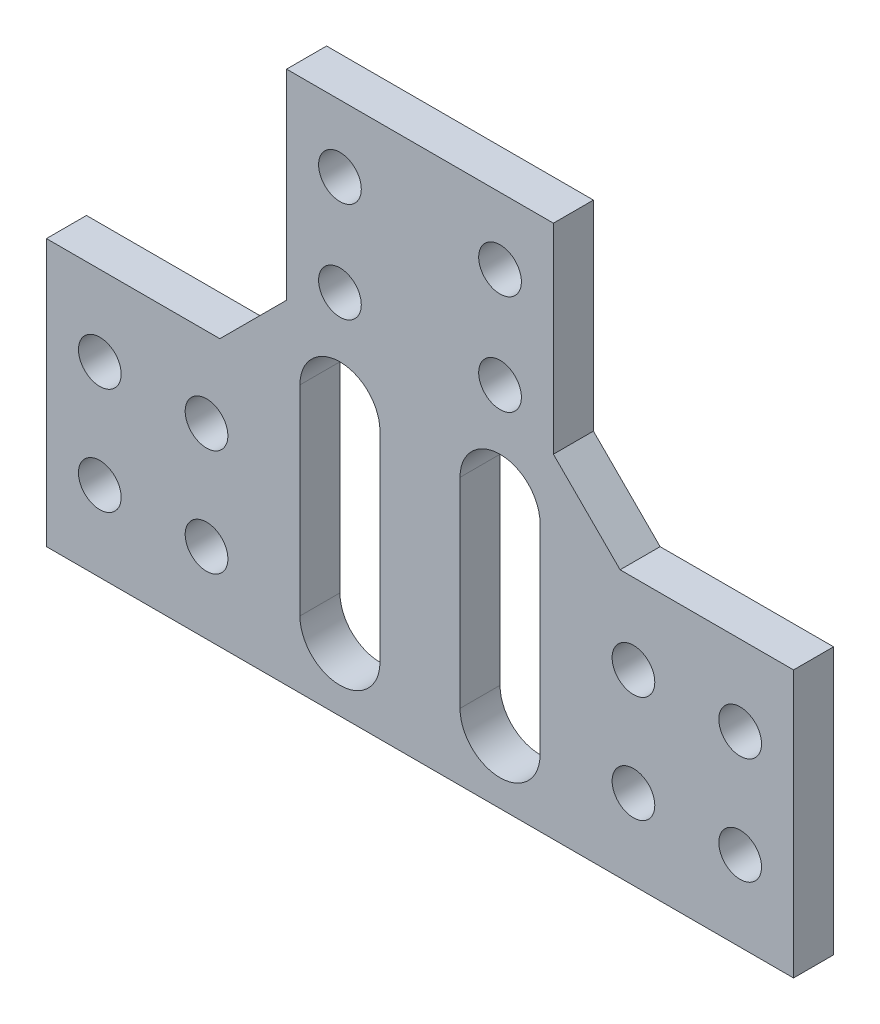
ISO-10303-21;
HEADER;
FILE_DESCRIPTION(('STEP AP214'),'2;1');
FILE_NAME('part.step','',(''),(''),'','','');
FILE_SCHEMA(('AUTOMOTIVE_DESIGN { 1 0 10303 214 1 1 1 1 }'));
ENDSEC;
DATA;
#1=APPLICATION_CONTEXT('core data for automotive mechanical design processes');
#2=APPLICATION_PROTOCOL_DEFINITION('international standard','automotive_design',2000,#1);
#3=PRODUCT_CONTEXT('',#1,'mechanical');
#4=PRODUCT('Part','Part','',(#3));
#5=PRODUCT_RELATED_PRODUCT_CATEGORY('part','',(#4));
#6=PRODUCT_DEFINITION_FORMATION('','',#4);
#7=PRODUCT_DEFINITION_CONTEXT('part definition',#1,'design');
#8=PRODUCT_DEFINITION('design','',#6,#7);
#9=PRODUCT_DEFINITION_SHAPE('','',#8);
#10=(LENGTH_UNIT() NAMED_UNIT(*) SI_UNIT(.MILLI.,.METRE.));
#11=(NAMED_UNIT(*) PLANE_ANGLE_UNIT() SI_UNIT($,.RADIAN.));
#12=(NAMED_UNIT(*) SI_UNIT($,.STERADIAN.) SOLID_ANGLE_UNIT());
#13=UNCERTAINTY_MEASURE_WITH_UNIT(LENGTH_MEASURE(1.E-05),#10,'distance_accuracy_value','');
#14=(GEOMETRIC_REPRESENTATION_CONTEXT(3) GLOBAL_UNCERTAINTY_ASSIGNED_CONTEXT((#13)) GLOBAL_UNIT_ASSIGNED_CONTEXT((#10,
#11,#12)) REPRESENTATION_CONTEXT('',''));
#15=CARTESIAN_POINT('',(0.,0.,0.));
#16=DIRECTION('',(0.,0.,1.));
#17=DIRECTION('',(1.,0.,0.));
#18=AXIS2_PLACEMENT_3D('',#15,#16,#17);
#19=CARTESIAN_POINT('',(0.,20.,3.));
#20=DIRECTION('',(1.,0.,0.));
#21=DIRECTION('',(0.,1.,0.));
#22=AXIS2_PLACEMENT_3D('',#19,#20,#21);
#23=PLANE('',#22);
#24=DIRECTION('',(0.,-1.,0.));
#25=VECTOR('',#24,1.);
#26=CARTESIAN_POINT('',(0.,20.,0.));
#27=LINE('',#26,#25);
#28=CARTESIAN_POINT('',(0.,20.,0.));
#29=VERTEX_POINT('',#28);
#30=CARTESIAN_POINT('',(0.,0.,0.));
#31=VERTEX_POINT('',#30);
#32=EDGE_CURVE('E280',#29,#31,#27,.T.);
#33=ORIENTED_EDGE('',*,*,#32,.T.);
#34=DIRECTION('',(0.,0.,-1.));
#35=VECTOR('',#34,1.);
#36=CARTESIAN_POINT('',(0.,0.,3.));
#37=LINE('',#36,#35);
#38=CARTESIAN_POINT('',(0.,0.,3.));
#39=VERTEX_POINT('',#38);
#40=EDGE_CURVE('E351',#39,#31,#37,.T.);
#41=ORIENTED_EDGE('',*,*,#40,.F.);
#42=DIRECTION('',(0.,-1.,0.));
#43=VECTOR('',#42,1.);
#44=CARTESIAN_POINT('',(0.,20.,3.));
#45=LINE('',#44,#43);
#46=CARTESIAN_POINT('',(0.,20.,3.));
#47=VERTEX_POINT('',#46);
#48=EDGE_CURVE('E283',#47,#39,#45,.T.);
#49=ORIENTED_EDGE('',*,*,#48,.F.);
#50=DIRECTION('',(0.,0.,-1.));
#51=VECTOR('',#50,1.);
#52=CARTESIAN_POINT('',(0.,20.,3.));
#53=LINE('',#52,#51);
#54=EDGE_CURVE('E305',#47,#29,#53,.T.);
#55=ORIENTED_EDGE('',*,*,#54,.T.);
#56=EDGE_LOOP('',(#33,#41,#49,#55));
#57=FACE_BOUND('',#56,.T.);
#58=ADVANCED_FACE('F35',(#57),#23,.F.);
#59=CARTESIAN_POINT('',(0.,0.,3.));
#60=DIRECTION('',(0.,1.,0.));
#61=DIRECTION('',(-1.,0.,0.));
#62=AXIS2_PLACEMENT_3D('',#59,#60,#61);
#63=PLANE('',#62);
#64=DIRECTION('',(1.,0.,0.));
#65=VECTOR('',#64,1.);
#66=CARTESIAN_POINT('',(0.,0.,0.));
#67=LINE('',#66,#65);
#68=CARTESIAN_POINT('',(56.,0.,0.));
#69=VERTEX_POINT('',#68);
#70=EDGE_CURVE('E308',#31,#69,#67,.T.);
#71=ORIENTED_EDGE('',*,*,#70,.T.);
#72=DIRECTION('',(0.,0.,-1.));
#73=VECTOR('',#72,1.);
#74=CARTESIAN_POINT('',(56.,0.,3.));
#75=LINE('',#74,#73);
#76=CARTESIAN_POINT('',(56.,0.,3.));
#77=VERTEX_POINT('',#76);
#78=EDGE_CURVE('E348',#77,#69,#75,.T.);
#79=ORIENTED_EDGE('',*,*,#78,.F.);
#80=DIRECTION('',(1.,0.,0.));
#81=VECTOR('',#80,1.);
#82=CARTESIAN_POINT('',(0.,0.,3.));
#83=LINE('',#82,#81);
#84=EDGE_CURVE('E286',#39,#77,#83,.T.);
#85=ORIENTED_EDGE('',*,*,#84,.F.);
#86=ORIENTED_EDGE('',*,*,#40,.T.);
#87=EDGE_LOOP('',(#71,#79,#85,#86));
#88=FACE_BOUND('',#87,.T.);
#89=ADVANCED_FACE('F390',(#88),#63,.F.);
#90=CARTESIAN_POINT('',(56.,0.,3.));
#91=DIRECTION('',(-1.,0.,0.));
#92=DIRECTION('',(0.,0.,1.));
#93=AXIS2_PLACEMENT_3D('',#90,#91,#92);
#94=PLANE('',#93);
#95=DIRECTION('',(0.,1.,0.));
#96=VECTOR('',#95,1.);
#97=CARTESIAN_POINT('',(56.,0.,0.));
#98=LINE('',#97,#96);
#99=CARTESIAN_POINT('',(56.,20.,0.));
#100=VERTEX_POINT('',#99);
#101=EDGE_CURVE('E310',#69,#100,#98,.T.);
#102=ORIENTED_EDGE('',*,*,#101,.T.);
#103=DIRECTION('',(0.,0.,-1.));
#104=VECTOR('',#103,1.);
#105=CARTESIAN_POINT('',(56.,20.,3.));
#106=LINE('',#105,#104);
#107=CARTESIAN_POINT('',(56.,20.,3.));
#108=VERTEX_POINT('',#107);
#109=EDGE_CURVE('E345',#108,#100,#106,.T.);
#110=ORIENTED_EDGE('',*,*,#109,.F.);
#111=DIRECTION('',(0.,1.,0.));
#112=VECTOR('',#111,1.);
#113=CARTESIAN_POINT('',(56.,0.,3.));
#114=LINE('',#113,#112);
#115=EDGE_CURVE('E289',#77,#108,#114,.T.);
#116=ORIENTED_EDGE('',*,*,#115,.F.);
#117=ORIENTED_EDGE('',*,*,#78,.T.);
#118=EDGE_LOOP('',(#102,#110,#116,#117));
#119=FACE_BOUND('',#118,.T.);
#120=ADVANCED_FACE('F395',(#119),#94,.F.);
#121=CARTESIAN_POINT('',(56.,20.,3.));
#122=DIRECTION('',(0.,-1.,0.));
#123=DIRECTION('',(1.,0.,0.));
#124=AXIS2_PLACEMENT_3D('',#121,#122,#123);
#125=PLANE('',#124);
#126=DIRECTION('',(-1.,0.,0.));
#127=VECTOR('',#126,1.);
#128=CARTESIAN_POINT('',(56.,20.,0.));
#129=LINE('',#128,#127);
#130=CARTESIAN_POINT('',(43.,20.,0.));
#131=VERTEX_POINT('',#130);
#132=EDGE_CURVE('E312',#100,#131,#129,.T.);
#133=ORIENTED_EDGE('',*,*,#132,.T.);
#134=DIRECTION('',(0.,0.,-1.));
#135=VECTOR('',#134,1.);
#136=CARTESIAN_POINT('',(43.,20.,3.));
#137=LINE('',#136,#135);
#138=CARTESIAN_POINT('',(43.,20.,3.));
#139=VERTEX_POINT('',#138);
#140=EDGE_CURVE('E342',#139,#131,#137,.T.);
#141=ORIENTED_EDGE('',*,*,#140,.F.);
#142=DIRECTION('',(-1.,0.,0.));
#143=VECTOR('',#142,1.);
#144=CARTESIAN_POINT('',(56.,20.,3.));
#145=LINE('',#144,#143);
#146=EDGE_CURVE('E291',#108,#139,#145,.T.);
#147=ORIENTED_EDGE('',*,*,#146,.F.);
#148=ORIENTED_EDGE('',*,*,#109,.T.);
#149=EDGE_LOOP('',(#133,#141,#147,#148));
#150=FACE_BOUND('',#149,.T.);
#151=ADVANCED_FACE('F439',(#150),#125,.F.);
#152=CARTESIAN_POINT('',(43.,20.,3.));
#153=DIRECTION('',(-0.707106781186549,-0.707106781186546,0.));
#154=DIRECTION('',(0.707106781186546,-0.707106781186549,0.));
#155=AXIS2_PLACEMENT_3D('',#152,#153,#154);
#156=PLANE('',#155);
#157=DIRECTION('',(-0.707106781186546,0.707106781186549,0.));
#158=VECTOR('',#157,1.);
#159=CARTESIAN_POINT('',(43.,20.,0.));
#160=LINE('',#159,#158);
#161=CARTESIAN_POINT('',(38.,25.,0.));
#162=VERTEX_POINT('',#161);
#163=EDGE_CURVE('E314',#131,#162,#160,.T.);
#164=ORIENTED_EDGE('',*,*,#163,.T.);
#165=DIRECTION('',(0.,0.,-1.));
#166=VECTOR('',#165,1.);
#167=CARTESIAN_POINT('',(38.,25.,3.));
#168=LINE('',#167,#166);
#169=CARTESIAN_POINT('',(38.,25.,3.));
#170=VERTEX_POINT('',#169);
#171=EDGE_CURVE('E339',#170,#162,#168,.T.);
#172=ORIENTED_EDGE('',*,*,#171,.F.);
#173=DIRECTION('',(-0.707106781186546,0.707106781186549,0.));
#174=VECTOR('',#173,1.);
#175=CARTESIAN_POINT('',(43.,20.,3.));
#176=LINE('',#175,#174);
#177=EDGE_CURVE('E293',#139,#170,#176,.T.);
#178=ORIENTED_EDGE('',*,*,#177,.F.);
#179=ORIENTED_EDGE('',*,*,#140,.T.);
#180=EDGE_LOOP('',(#164,#172,#178,#179));
#181=FACE_BOUND('',#180,.T.);
#182=ADVANCED_FACE('F434',(#181),#156,.F.);
#183=CARTESIAN_POINT('',(38.,25.,3.));
#184=DIRECTION('',(-1.,0.,0.));
#185=DIRECTION('',(0.,0.,1.));
#186=AXIS2_PLACEMENT_3D('',#183,#184,#185);
#187=PLANE('',#186);
#188=DIRECTION('',(0.,1.,0.));
#189=VECTOR('',#188,1.);
#190=CARTESIAN_POINT('',(38.,25.,0.));
#191=LINE('',#190,#189);
#192=CARTESIAN_POINT('',(38.,40.,0.));
#193=VERTEX_POINT('',#192);
#194=EDGE_CURVE('E316',#162,#193,#191,.T.);
#195=ORIENTED_EDGE('',*,*,#194,.T.);
#196=DIRECTION('',(0.,0.,-1.));
#197=VECTOR('',#196,1.);
#198=CARTESIAN_POINT('',(38.,40.,3.));
#199=LINE('',#198,#197);
#200=CARTESIAN_POINT('',(38.,40.,3.));
#201=VERTEX_POINT('',#200);
#202=EDGE_CURVE('E336',#201,#193,#199,.T.);
#203=ORIENTED_EDGE('',*,*,#202,.F.);
#204=DIRECTION('',(0.,1.,0.));
#205=VECTOR('',#204,1.);
#206=CARTESIAN_POINT('',(38.,25.,3.));
#207=LINE('',#206,#205);
#208=EDGE_CURVE('E295',#170,#201,#207,.T.);
#209=ORIENTED_EDGE('',*,*,#208,.F.);
#210=ORIENTED_EDGE('',*,*,#171,.T.);
#211=EDGE_LOOP('',(#195,#203,#209,#210));
#212=FACE_BOUND('',#211,.T.);
#213=ADVANCED_FACE('F430',(#212),#187,.F.);
#214=CARTESIAN_POINT('',(38.,40.,3.));
#215=DIRECTION('',(0.,-1.,0.));
#216=DIRECTION('',(0.,0.,-1.));
#217=AXIS2_PLACEMENT_3D('',#214,#215,#216);
#218=PLANE('',#217);
#219=DIRECTION('',(-1.,0.,0.));
#220=VECTOR('',#219,1.);
#221=CARTESIAN_POINT('',(38.,40.,0.));
#222=LINE('',#221,#220);
#223=CARTESIAN_POINT('',(18.,40.,0.));
#224=VERTEX_POINT('',#223);
#225=EDGE_CURVE('E318',#193,#224,#222,.T.);
#226=ORIENTED_EDGE('',*,*,#225,.T.);
#227=DIRECTION('',(0.,0.,-1.));
#228=VECTOR('',#227,1.);
#229=CARTESIAN_POINT('',(18.,40.,3.));
#230=LINE('',#229,#228);
#231=CARTESIAN_POINT('',(18.,40.,3.));
#232=VERTEX_POINT('',#231);
#233=EDGE_CURVE('E333',#232,#224,#230,.T.);
#234=ORIENTED_EDGE('',*,*,#233,.F.);
#235=DIRECTION('',(-1.,0.,0.));
#236=VECTOR('',#235,1.);
#237=CARTESIAN_POINT('',(38.,40.,3.));
#238=LINE('',#237,#236);
#239=EDGE_CURVE('E297',#201,#232,#238,.T.);
#240=ORIENTED_EDGE('',*,*,#239,.F.);
#241=ORIENTED_EDGE('',*,*,#202,.T.);
#242=EDGE_LOOP('',(#226,#234,#240,#241));
#243=FACE_BOUND('',#242,.T.);
#244=ADVANCED_FACE('F426',(#243),#218,.F.);
#245=CARTESIAN_POINT('',(18.,40.,3.));
#246=DIRECTION('',(1.,0.,0.));
#247=DIRECTION('',(0.,1.,0.));
#248=AXIS2_PLACEMENT_3D('',#245,#246,#247);
#249=PLANE('',#248);
#250=DIRECTION('',(0.,-1.,0.));
#251=VECTOR('',#250,1.);
#252=CARTESIAN_POINT('',(18.,40.,0.));
#253=LINE('',#252,#251);
#254=CARTESIAN_POINT('',(18.,25.,0.));
#255=VERTEX_POINT('',#254);
#256=EDGE_CURVE('E320',#224,#255,#253,.T.);
#257=ORIENTED_EDGE('',*,*,#256,.T.);
#258=DIRECTION('',(0.,0.,-1.));
#259=VECTOR('',#258,1.);
#260=CARTESIAN_POINT('',(18.,25.,3.));
#261=LINE('',#260,#259);
#262=CARTESIAN_POINT('',(18.,25.,3.));
#263=VERTEX_POINT('',#262);
#264=EDGE_CURVE('E330',#263,#255,#261,.T.);
#265=ORIENTED_EDGE('',*,*,#264,.F.);
#266=DIRECTION('',(0.,-1.,0.));
#267=VECTOR('',#266,1.);
#268=CARTESIAN_POINT('',(18.,40.,3.));
#269=LINE('',#268,#267);
#270=EDGE_CURVE('E299',#232,#263,#269,.T.);
#271=ORIENTED_EDGE('',*,*,#270,.F.);
#272=ORIENTED_EDGE('',*,*,#233,.T.);
#273=EDGE_LOOP('',(#257,#265,#271,#272));
#274=FACE_BOUND('',#273,.T.);
#275=ADVANCED_FACE('F421',(#274),#249,.F.);
#276=CARTESIAN_POINT('',(18.,25.,3.));
#277=DIRECTION('',(0.707106781186549,-0.707106781186546,0.));
#278=DIRECTION('',(0.707106781186546,0.707106781186549,0.));
#279=AXIS2_PLACEMENT_3D('',#276,#277,#278);
#280=PLANE('',#279);
#281=DIRECTION('',(-0.707106781186546,-0.707106781186549,0.));
#282=VECTOR('',#281,1.);
#283=CARTESIAN_POINT('',(18.,25.,0.));
#284=LINE('',#283,#282);
#285=CARTESIAN_POINT('',(13.,20.,0.));
#286=VERTEX_POINT('',#285);
#287=EDGE_CURVE('E322',#255,#286,#284,.T.);
#288=ORIENTED_EDGE('',*,*,#287,.T.);
#289=DIRECTION('',(0.,0.,-1.));
#290=VECTOR('',#289,1.);
#291=CARTESIAN_POINT('',(13.,20.,3.));
#292=LINE('',#291,#290);
#293=CARTESIAN_POINT('',(13.,20.,3.));
#294=VERTEX_POINT('',#293);
#295=EDGE_CURVE('E327',#294,#286,#292,.T.);
#296=ORIENTED_EDGE('',*,*,#295,.F.);
#297=DIRECTION('',(-0.707106781186546,-0.707106781186549,0.));
#298=VECTOR('',#297,1.);
#299=CARTESIAN_POINT('',(18.,25.,3.));
#300=LINE('',#299,#298);
#301=EDGE_CURVE('E301',#263,#294,#300,.T.);
#302=ORIENTED_EDGE('',*,*,#301,.F.);
#303=ORIENTED_EDGE('',*,*,#264,.T.);
#304=EDGE_LOOP('',(#288,#296,#302,#303));
#305=FACE_BOUND('',#304,.T.);
#306=ADVANCED_FACE('F415',(#305),#280,.F.);
#307=CARTESIAN_POINT('',(13.,20.,3.));
#308=DIRECTION('',(0.,-1.,0.));
#309=DIRECTION('',(0.,0.,-1.));
#310=AXIS2_PLACEMENT_3D('',#307,#308,#309);
#311=PLANE('',#310);
#312=DIRECTION('',(-1.,0.,0.));
#313=VECTOR('',#312,1.);
#314=CARTESIAN_POINT('',(13.,20.,0.));
#315=LINE('',#314,#313);
#316=EDGE_CURVE('E287',#286,#29,#315,.T.);
#317=ORIENTED_EDGE('',*,*,#316,.T.);
#318=ORIENTED_EDGE('',*,*,#54,.F.);
#319=DIRECTION('',(-1.,0.,0.));
#320=VECTOR('',#319,1.);
#321=CARTESIAN_POINT('',(13.,20.,3.));
#322=LINE('',#321,#320);
#323=EDGE_CURVE('E303',#294,#47,#322,.T.);
#324=ORIENTED_EDGE('',*,*,#323,.F.);
#325=ORIENTED_EDGE('',*,*,#295,.T.);
#326=EDGE_LOOP('',(#317,#318,#324,#325));
#327=FACE_BOUND('',#326,.T.);
#328=ADVANCED_FACE('F413',(#327),#311,.F.);
#329=CARTESIAN_POINT('',(0.,0.,3.));
#330=DIRECTION('',(0.,0.,1.));
#331=DIRECTION('',(1.,0.,0.));
#332=AXIS2_PLACEMENT_3D('',#329,#330,#331);
#333=PLANE('',#332);
#334=CARTESIAN_POINT('',(22.,20.,3.));
#335=DIRECTION('',(0.,0.,1.));
#336=DIRECTION('',(1.,0.,0.));
#337=AXIS2_PLACEMENT_3D('',#334,#335,#336);
#338=CIRCLE('',#337,3.);
#339=CARTESIAN_POINT('',(25.,20.,3.));
#340=VERTEX_POINT('',#339);
#341=CARTESIAN_POINT('',(19.,20.,3.));
#342=VERTEX_POINT('',#341);
#343=EDGE_CURVE('E49',#340,#342,#338,.T.);
#344=ORIENTED_EDGE('',*,*,#343,.F.);
#345=DIRECTION('',(0.,1.,0.));
#346=VECTOR('',#345,1.);
#347=CARTESIAN_POINT('',(25.,20.,3.));
#348=LINE('',#347,#346);
#349=CARTESIAN_POINT('',(25.,5.,3.));
#350=VERTEX_POINT('',#349);
#351=EDGE_CURVE('E183',#350,#340,#348,.T.);
#352=ORIENTED_EDGE('',*,*,#351,.F.);
#353=CARTESIAN_POINT('',(22.,5.,3.));
#354=DIRECTION('',(0.,0.,1.));
#355=DIRECTION('',(1.,0.,0.));
#356=AXIS2_PLACEMENT_3D('',#353,#354,#355);
#357=CIRCLE('',#356,3.);
#358=CARTESIAN_POINT('',(19.,5.,3.));
#359=VERTEX_POINT('',#358);
#360=EDGE_CURVE('E166',#359,#350,#357,.T.);
#361=ORIENTED_EDGE('',*,*,#360,.F.);
#362=DIRECTION('',(0.,-1.,0.));
#363=VECTOR('',#362,1.);
#364=CARTESIAN_POINT('',(19.,20.,3.));
#365=LINE('',#364,#363);
#366=EDGE_CURVE('E176',#342,#359,#365,.T.);
#367=ORIENTED_EDGE('',*,*,#366,.F.);
#368=EDGE_LOOP('',(#344,#352,#361,#367));
#369=FACE_BOUND('',#368,.T.);
#370=CARTESIAN_POINT('',(34.,20.,3.));
#371=DIRECTION('',(0.,0.,1.));
#372=DIRECTION('',(1.,0.,0.));
#373=AXIS2_PLACEMENT_3D('',#370,#371,#372);
#374=CIRCLE('',#373,3.);
#375=CARTESIAN_POINT('',(37.,20.,3.));
#376=VERTEX_POINT('',#375);
#377=CARTESIAN_POINT('',(31.,20.,3.));
#378=VERTEX_POINT('',#377);
#379=EDGE_CURVE('E57',#376,#378,#374,.T.);
#380=ORIENTED_EDGE('',*,*,#379,.F.);
#381=DIRECTION('',(0.,1.,0.));
#382=VECTOR('',#381,1.);
#383=CARTESIAN_POINT('',(37.,20.,3.));
#384=LINE('',#383,#382);
#385=CARTESIAN_POINT('',(37.,5.,3.));
#386=VERTEX_POINT('',#385);
#387=EDGE_CURVE('E200',#386,#376,#384,.T.);
#388=ORIENTED_EDGE('',*,*,#387,.F.);
#389=CARTESIAN_POINT('',(34.,5.,3.));
#390=DIRECTION('',(0.,0.,1.));
#391=DIRECTION('',(1.,0.,0.));
#392=AXIS2_PLACEMENT_3D('',#389,#390,#391);
#393=CIRCLE('',#392,3.);
#394=CARTESIAN_POINT('',(31.,5.,3.));
#395=VERTEX_POINT('',#394);
#396=EDGE_CURVE('E197',#395,#386,#393,.T.);
#397=ORIENTED_EDGE('',*,*,#396,.F.);
#398=DIRECTION('',(0.,-1.,0.));
#399=VECTOR('',#398,1.);
#400=CARTESIAN_POINT('',(31.,20.,3.));
#401=LINE('',#400,#399);
#402=EDGE_CURVE('E194',#378,#395,#401,.T.);
#403=ORIENTED_EDGE('',*,*,#402,.F.);
#404=EDGE_LOOP('',(#380,#388,#397,#403));
#405=FACE_BOUND('',#404,.T.);
#406=CARTESIAN_POINT('',(4.,6.,3.));
#407=DIRECTION('',(0.,0.,1.));
#408=DIRECTION('',(1.,0.,0.));
#409=AXIS2_PLACEMENT_3D('',#406,#407,#408);
#410=CIRCLE('',#409,1.6);
#411=CARTESIAN_POINT('',(5.6,6.,3.));
#412=VERTEX_POINT('',#411);
#413=EDGE_CURVE('E245',#412,#412,#410,.T.);
#414=ORIENTED_EDGE('',*,*,#413,.F.);
#415=EDGE_LOOP('',(#414));
#416=FACE_BOUND('',#415,.T.);
#417=CARTESIAN_POINT('',(12.,14.,3.));
#418=DIRECTION('',(0.,0.,1.));
#419=DIRECTION('',(1.,0.,0.));
#420=AXIS2_PLACEMENT_3D('',#417,#418,#419);
#421=CIRCLE('',#420,1.6);
#422=CARTESIAN_POINT('',(13.6,14.,3.));
#423=VERTEX_POINT('',#422);
#424=EDGE_CURVE('E232',#423,#423,#421,.T.);
#425=ORIENTED_EDGE('',*,*,#424,.F.);
#426=EDGE_LOOP('',(#425));
#427=FACE_BOUND('',#426,.T.);
#428=CARTESIAN_POINT('',(12.,6.,3.));
#429=DIRECTION('',(0.,0.,1.));
#430=DIRECTION('',(1.,0.,0.));
#431=AXIS2_PLACEMENT_3D('',#428,#429,#430);
#432=CIRCLE('',#431,1.6);
#433=CARTESIAN_POINT('',(13.6,6.,3.));
#434=VERTEX_POINT('',#433);
#435=EDGE_CURVE('E233',#434,#434,#432,.T.);
#436=ORIENTED_EDGE('',*,*,#435,.F.);
#437=EDGE_LOOP('',(#436));
#438=FACE_BOUND('',#437,.T.);
#439=CARTESIAN_POINT('',(52.,14.,3.));
#440=DIRECTION('',(0.,0.,1.));
#441=DIRECTION('',(1.,0.,0.));
#442=AXIS2_PLACEMENT_3D('',#439,#440,#441);
#443=CIRCLE('',#442,1.6);
#444=CARTESIAN_POINT('',(53.6,14.,3.));
#445=VERTEX_POINT('',#444);
#446=EDGE_CURVE('E214',#445,#445,#443,.T.);
#447=ORIENTED_EDGE('',*,*,#446,.F.);
#448=EDGE_LOOP('',(#447));
#449=FACE_BOUND('',#448,.T.);
#450=CARTESIAN_POINT('',(34.,35.,3.));
#451=DIRECTION('',(0.,0.,1.));
#452=DIRECTION('',(1.,0.,0.));
#453=AXIS2_PLACEMENT_3D('',#450,#451,#452);
#454=CIRCLE('',#453,1.6);
#455=CARTESIAN_POINT('',(35.6,35.,3.));
#456=VERTEX_POINT('',#455);
#457=EDGE_CURVE('E269',#456,#456,#454,.T.);
#458=ORIENTED_EDGE('',*,*,#457,.F.);
#459=EDGE_LOOP('',(#458));
#460=FACE_BOUND('',#459,.T.);
#461=CARTESIAN_POINT('',(22.,27.5,3.));
#462=DIRECTION('',(0.,0.,1.));
#463=DIRECTION('',(1.,0.,0.));
#464=AXIS2_PLACEMENT_3D('',#461,#462,#463);
#465=CIRCLE('',#464,1.6);
#466=CARTESIAN_POINT('',(23.6,27.5,3.));
#467=VERTEX_POINT('',#466);
#468=EDGE_CURVE('E256',#467,#467,#465,.T.);
#469=ORIENTED_EDGE('',*,*,#468,.F.);
#470=EDGE_LOOP('',(#469));
#471=FACE_BOUND('',#470,.T.);
#472=CARTESIAN_POINT('',(34.,27.5,3.));
#473=DIRECTION('',(0.,0.,1.));
#474=DIRECTION('',(1.,0.,0.));
#475=AXIS2_PLACEMENT_3D('',#472,#473,#474);
#476=CIRCLE('',#475,1.6);
#477=CARTESIAN_POINT('',(35.6,27.5,3.));
#478=VERTEX_POINT('',#477);
#479=EDGE_CURVE('E257',#478,#478,#476,.T.);
#480=ORIENTED_EDGE('',*,*,#479,.F.);
#481=EDGE_LOOP('',(#480));
#482=FACE_BOUND('',#481,.T.);
#483=CARTESIAN_POINT('',(4.,14.,3.));
#484=DIRECTION('',(0.,0.,1.));
#485=DIRECTION('',(1.,0.,0.));
#486=AXIS2_PLACEMENT_3D('',#483,#484,#485);
#487=CIRCLE('',#486,1.6);
#488=CARTESIAN_POINT('',(5.6,14.,3.));
#489=VERTEX_POINT('',#488);
#490=EDGE_CURVE('E244',#489,#489,#487,.T.);
#491=ORIENTED_EDGE('',*,*,#490,.F.);
#492=EDGE_LOOP('',(#491));
#493=FACE_BOUND('',#492,.T.);
#494=CARTESIAN_POINT('',(52.,6.,3.));
#495=DIRECTION('',(0.,0.,1.));
#496=DIRECTION('',(1.,0.,0.));
#497=AXIS2_PLACEMENT_3D('',#494,#495,#496);
#498=CIRCLE('',#497,1.6);
#499=CARTESIAN_POINT('',(53.6,6.,3.));
#500=VERTEX_POINT('',#499);
#501=EDGE_CURVE('E215',#500,#500,#498,.T.);
#502=ORIENTED_EDGE('',*,*,#501,.F.);
#503=EDGE_LOOP('',(#502));
#504=FACE_BOUND('',#503,.T.);
#505=CARTESIAN_POINT('',(44.,6.,3.));
#506=DIRECTION('',(0.,0.,1.));
#507=DIRECTION('',(1.,0.,0.));
#508=AXIS2_PLACEMENT_3D('',#505,#506,#507);
#509=CIRCLE('',#508,1.6);
#510=CARTESIAN_POINT('',(45.6,6.,3.));
#511=VERTEX_POINT('',#510);
#512=EDGE_CURVE('E221',#511,#511,#509,.T.);
#513=ORIENTED_EDGE('',*,*,#512,.F.);
#514=EDGE_LOOP('',(#513));
#515=FACE_BOUND('',#514,.T.);
#516=CARTESIAN_POINT('',(44.,14.,3.));
#517=DIRECTION('',(0.,0.,1.));
#518=DIRECTION('',(1.,0.,0.));
#519=AXIS2_PLACEMENT_3D('',#516,#517,#518);
#520=CIRCLE('',#519,1.6);
#521=CARTESIAN_POINT('',(45.6,14.,3.));
#522=VERTEX_POINT('',#521);
#523=EDGE_CURVE('E190',#522,#522,#520,.T.);
#524=ORIENTED_EDGE('',*,*,#523,.F.);
#525=EDGE_LOOP('',(#524));
#526=FACE_BOUND('',#525,.T.);
#527=CARTESIAN_POINT('',(22.,35.,3.));
#528=DIRECTION('',(0.,0.,1.));
#529=DIRECTION('',(1.,0.,0.));
#530=AXIS2_PLACEMENT_3D('',#527,#528,#529);
#531=CIRCLE('',#530,1.6);
#532=CARTESIAN_POINT('',(23.6,35.,3.));
#533=VERTEX_POINT('',#532);
#534=EDGE_CURVE('E268',#533,#533,#531,.T.);
#535=ORIENTED_EDGE('',*,*,#534,.F.);
#536=EDGE_LOOP('',(#535));
#537=FACE_BOUND('',#536,.T.);
#538=ORIENTED_EDGE('',*,*,#48,.T.);
#539=ORIENTED_EDGE('',*,*,#84,.T.);
#540=ORIENTED_EDGE('',*,*,#115,.T.);
#541=ORIENTED_EDGE('',*,*,#146,.T.);
#542=ORIENTED_EDGE('',*,*,#177,.T.);
#543=ORIENTED_EDGE('',*,*,#208,.T.);
#544=ORIENTED_EDGE('',*,*,#239,.T.);
#545=ORIENTED_EDGE('',*,*,#270,.T.);
#546=ORIENTED_EDGE('',*,*,#301,.T.);
#547=ORIENTED_EDGE('',*,*,#323,.T.);
#548=EDGE_LOOP('',(#538,#539,#540,#541,#542,#543,#544,#545,#546,#547));
#549=FACE_BOUND('',#548,.T.);
#550=ADVANCED_FACE('F180',(#369,#405,#416,#427,#438,#449,#460,#471,#482,#493,#504,#515,#526,
#537,#549),#333,.T.);
#551=CARTESIAN_POINT('',(0.,0.,0.));
#552=DIRECTION('',(0.,0.,1.));
#553=DIRECTION('',(1.,0.,0.));
#554=AXIS2_PLACEMENT_3D('',#551,#552,#553);
#555=PLANE('',#554);
#556=DIRECTION('',(0.,1.,0.));
#557=VECTOR('',#556,1.);
#558=CARTESIAN_POINT('',(25.,0.,0.));
#559=LINE('',#558,#557);
#560=CARTESIAN_POINT('',(25.,5.,0.));
#561=VERTEX_POINT('',#560);
#562=CARTESIAN_POINT('',(25.,20.,0.));
#563=VERTEX_POINT('',#562);
#564=EDGE_CURVE('E42',#561,#563,#559,.T.);
#565=ORIENTED_EDGE('',*,*,#564,.T.);
#566=CARTESIAN_POINT('',(22.,20.,0.));
#567=DIRECTION('',(0.,0.,1.));
#568=DIRECTION('',(1.,0.,0.));
#569=AXIS2_PLACEMENT_3D('',#566,#567,#568);
#570=CIRCLE('',#569,3.);
#571=CARTESIAN_POINT('',(19.,20.,0.));
#572=VERTEX_POINT('',#571);
#573=EDGE_CURVE('E11',#563,#572,#570,.T.);
#574=ORIENTED_EDGE('',*,*,#573,.T.);
#575=DIRECTION('',(0.,-1.,0.));
#576=VECTOR('',#575,1.);
#577=CARTESIAN_POINT('',(19.,0.,0.));
#578=LINE('',#577,#576);
#579=CARTESIAN_POINT('',(19.,5.,0.));
#580=VERTEX_POINT('',#579);
#581=EDGE_CURVE('E366',#572,#580,#578,.T.);
#582=ORIENTED_EDGE('',*,*,#581,.T.);
#583=CARTESIAN_POINT('',(22.,5.,0.));
#584=DIRECTION('',(0.,0.,1.));
#585=DIRECTION('',(1.,0.,0.));
#586=AXIS2_PLACEMENT_3D('',#583,#584,#585);
#587=CIRCLE('',#586,3.);
#588=EDGE_CURVE('E169',#580,#561,#587,.T.);
#589=ORIENTED_EDGE('',*,*,#588,.T.);
#590=EDGE_LOOP('',(#565,#574,#582,#589));
#591=FACE_BOUND('',#590,.T.);
#592=DIRECTION('',(0.,1.,0.));
#593=VECTOR('',#592,1.);
#594=CARTESIAN_POINT('',(37.,0.,0.));
#595=LINE('',#594,#593);
#596=CARTESIAN_POINT('',(37.,5.,0.));
#597=VERTEX_POINT('',#596);
#598=CARTESIAN_POINT('',(37.,20.,0.));
#599=VERTEX_POINT('',#598);
#600=EDGE_CURVE('E360',#597,#599,#595,.T.);
#601=ORIENTED_EDGE('',*,*,#600,.T.);
#602=CARTESIAN_POINT('',(34.,20.,0.));
#603=DIRECTION('',(0.,0.,1.));
#604=DIRECTION('',(1.,0.,0.));
#605=AXIS2_PLACEMENT_3D('',#602,#603,#604);
#606=CIRCLE('',#605,3.);
#607=CARTESIAN_POINT('',(31.,20.,0.));
#608=VERTEX_POINT('',#607);
#609=EDGE_CURVE('E363',#599,#608,#606,.T.);
#610=ORIENTED_EDGE('',*,*,#609,.T.);
#611=DIRECTION('',(0.,-1.,0.));
#612=VECTOR('',#611,1.);
#613=CARTESIAN_POINT('',(31.,0.,0.));
#614=LINE('',#613,#612);
#615=CARTESIAN_POINT('',(31.,5.,0.));
#616=VERTEX_POINT('',#615);
#617=EDGE_CURVE('E354',#608,#616,#614,.T.);
#618=ORIENTED_EDGE('',*,*,#617,.T.);
#619=CARTESIAN_POINT('',(34.,5.,0.));
#620=DIRECTION('',(0.,0.,1.));
#621=DIRECTION('',(1.,0.,0.));
#622=AXIS2_PLACEMENT_3D('',#619,#620,#621);
#623=CIRCLE('',#622,3.);
#624=EDGE_CURVE('E357',#616,#597,#623,.T.);
#625=ORIENTED_EDGE('',*,*,#624,.T.);
#626=EDGE_LOOP('',(#601,#610,#618,#625));
#627=FACE_BOUND('',#626,.T.);
#628=CARTESIAN_POINT('',(4.,6.,0.));
#629=DIRECTION('',(0.,0.,1.));
#630=DIRECTION('',(1.,0.,0.));
#631=AXIS2_PLACEMENT_3D('',#628,#629,#630);
#632=CIRCLE('',#631,1.6);
#633=CARTESIAN_POINT('',(5.6,6.,0.));
#634=VERTEX_POINT('',#633);
#635=EDGE_CURVE('E241',#634,#634,#632,.T.);
#636=ORIENTED_EDGE('',*,*,#635,.T.);
#637=EDGE_LOOP('',(#636));
#638=FACE_BOUND('',#637,.T.);
#639=CARTESIAN_POINT('',(12.,14.,0.));
#640=DIRECTION('',(0.,0.,1.));
#641=DIRECTION('',(1.,0.,0.));
#642=AXIS2_PLACEMENT_3D('',#639,#640,#641);
#643=CIRCLE('',#642,1.6);
#644=CARTESIAN_POINT('',(13.6,14.,0.));
#645=VERTEX_POINT('',#644);
#646=EDGE_CURVE('E248',#645,#645,#643,.T.);
#647=ORIENTED_EDGE('',*,*,#646,.T.);
#648=EDGE_LOOP('',(#647));
#649=FACE_BOUND('',#648,.T.);
#650=CARTESIAN_POINT('',(12.,6.,0.));
#651=DIRECTION('',(0.,0.,1.));
#652=DIRECTION('',(1.,0.,0.));
#653=AXIS2_PLACEMENT_3D('',#650,#651,#652);
#654=CIRCLE('',#653,1.6);
#655=CARTESIAN_POINT('',(13.6,6.,0.));
#656=VERTEX_POINT('',#655);
#657=EDGE_CURVE('E229',#656,#656,#654,.T.);
#658=ORIENTED_EDGE('',*,*,#657,.T.);
#659=EDGE_LOOP('',(#658));
#660=FACE_BOUND('',#659,.T.);
#661=CARTESIAN_POINT('',(52.,14.,0.));
#662=DIRECTION('',(0.,0.,1.));
#663=DIRECTION('',(1.,0.,0.));
#664=AXIS2_PLACEMENT_3D('',#661,#662,#663);
#665=CIRCLE('',#664,1.6);
#666=CARTESIAN_POINT('',(53.6,14.,0.));
#667=VERTEX_POINT('',#666);
#668=EDGE_CURVE('E236',#667,#667,#665,.T.);
#669=ORIENTED_EDGE('',*,*,#668,.T.);
#670=EDGE_LOOP('',(#669));
#671=FACE_BOUND('',#670,.T.);
#672=CARTESIAN_POINT('',(34.,35.,0.));
#673=DIRECTION('',(0.,0.,1.));
#674=DIRECTION('',(1.,0.,0.));
#675=AXIS2_PLACEMENT_3D('',#672,#673,#674);
#676=CIRCLE('',#675,1.6);
#677=CARTESIAN_POINT('',(35.6,35.,0.));
#678=VERTEX_POINT('',#677);
#679=EDGE_CURVE('E265',#678,#678,#676,.T.);
#680=ORIENTED_EDGE('',*,*,#679,.T.);
#681=EDGE_LOOP('',(#680));
#682=FACE_BOUND('',#681,.T.);
#683=CARTESIAN_POINT('',(22.,27.5,0.));
#684=DIRECTION('',(0.,0.,1.));
#685=DIRECTION('',(1.,0.,0.));
#686=AXIS2_PLACEMENT_3D('',#683,#684,#685);
#687=CIRCLE('',#686,1.6);
#688=CARTESIAN_POINT('',(23.6,27.5,0.));
#689=VERTEX_POINT('',#688);
#690=EDGE_CURVE('E272',#689,#689,#687,.T.);
#691=ORIENTED_EDGE('',*,*,#690,.T.);
#692=EDGE_LOOP('',(#691));
#693=FACE_BOUND('',#692,.T.);
#694=CARTESIAN_POINT('',(34.,27.5,0.));
#695=DIRECTION('',(0.,0.,1.));
#696=DIRECTION('',(1.,0.,0.));
#697=AXIS2_PLACEMENT_3D('',#694,#695,#696);
#698=CIRCLE('',#697,1.6);
#699=CARTESIAN_POINT('',(35.6,27.5,0.));
#700=VERTEX_POINT('',#699);
#701=EDGE_CURVE('E253',#700,#700,#698,.T.);
#702=ORIENTED_EDGE('',*,*,#701,.T.);
#703=EDGE_LOOP('',(#702));
#704=FACE_BOUND('',#703,.T.);
#705=CARTESIAN_POINT('',(4.,14.,0.));
#706=DIRECTION('',(0.,0.,1.));
#707=DIRECTION('',(1.,0.,0.));
#708=AXIS2_PLACEMENT_3D('',#705,#706,#707);
#709=CIRCLE('',#708,1.6);
#710=CARTESIAN_POINT('',(5.6,14.,0.));
#711=VERTEX_POINT('',#710);
#712=EDGE_CURVE('E260',#711,#711,#709,.T.);
#713=ORIENTED_EDGE('',*,*,#712,.T.);
#714=EDGE_LOOP('',(#713));
#715=FACE_BOUND('',#714,.T.);
#716=CARTESIAN_POINT('',(52.,6.,0.));
#717=DIRECTION('',(0.,0.,1.));
#718=DIRECTION('',(1.,0.,0.));
#719=AXIS2_PLACEMENT_3D('',#716,#717,#718);
#720=CIRCLE('',#719,1.6);
#721=CARTESIAN_POINT('',(53.6,6.,0.));
#722=VERTEX_POINT('',#721);
#723=EDGE_CURVE('E211',#722,#722,#720,.T.);
#724=ORIENTED_EDGE('',*,*,#723,.T.);
#725=EDGE_LOOP('',(#724));
#726=FACE_BOUND('',#725,.T.);
#727=CARTESIAN_POINT('',(44.,6.,0.));
#728=DIRECTION('',(0.,0.,1.));
#729=DIRECTION('',(1.,0.,0.));
#730=AXIS2_PLACEMENT_3D('',#727,#728,#729);
#731=CIRCLE('',#730,1.6);
#732=CARTESIAN_POINT('',(45.6,6.,0.));
#733=VERTEX_POINT('',#732);
#734=EDGE_CURVE('E218',#733,#733,#731,.T.);
#735=ORIENTED_EDGE('',*,*,#734,.T.);
#736=EDGE_LOOP('',(#735));
#737=FACE_BOUND('',#736,.T.);
#738=CARTESIAN_POINT('',(44.,14.,0.));
#739=DIRECTION('',(0.,0.,1.));
#740=DIRECTION('',(1.,0.,0.));
#741=AXIS2_PLACEMENT_3D('',#738,#739,#740);
#742=CIRCLE('',#741,1.6);
#743=CARTESIAN_POINT('',(45.6,14.,0.));
#744=VERTEX_POINT('',#743);
#745=EDGE_CURVE('E224',#744,#744,#742,.T.);
#746=ORIENTED_EDGE('',*,*,#745,.T.);
#747=EDGE_LOOP('',(#746));
#748=FACE_BOUND('',#747,.T.);
#749=CARTESIAN_POINT('',(22.,35.,0.));
#750=DIRECTION('',(0.,0.,1.));
#751=DIRECTION('',(1.,0.,0.));
#752=AXIS2_PLACEMENT_3D('',#749,#750,#751);
#753=CIRCLE('',#752,1.6);
#754=CARTESIAN_POINT('',(23.6,35.,0.));
#755=VERTEX_POINT('',#754);
#756=EDGE_CURVE('E277',#755,#755,#753,.T.);
#757=ORIENTED_EDGE('',*,*,#756,.T.);
#758=EDGE_LOOP('',(#757));
#759=FACE_BOUND('',#758,.T.);
#760=ORIENTED_EDGE('',*,*,#32,.F.);
#761=ORIENTED_EDGE('',*,*,#316,.F.);
#762=ORIENTED_EDGE('',*,*,#287,.F.);
#763=ORIENTED_EDGE('',*,*,#256,.F.);
#764=ORIENTED_EDGE('',*,*,#225,.F.);
#765=ORIENTED_EDGE('',*,*,#194,.F.);
#766=ORIENTED_EDGE('',*,*,#163,.F.);
#767=ORIENTED_EDGE('',*,*,#132,.F.);
#768=ORIENTED_EDGE('',*,*,#101,.F.);
#769=ORIENTED_EDGE('',*,*,#70,.F.);
#770=EDGE_LOOP('',(#760,#761,#762,#763,#764,#765,#766,#767,#768,#769));
#771=FACE_BOUND('',#770,.T.);
#772=ADVANCED_FACE('F370',(#591,#627,#638,#649,#660,#671,#682,#693,#704,#715,#726,#737,#748,
#759,#771),#555,.F.);
#773=CARTESIAN_POINT('',(22.,35.,0.));
#774=DIRECTION('',(0.,0.,1.));
#775=DIRECTION('',(1.,0.,0.));
#776=AXIS2_PLACEMENT_3D('',#773,#774,#775);
#777=CYLINDRICAL_SURFACE('',#776,1.6);
#778=ORIENTED_EDGE('',*,*,#756,.F.);
#779=EDGE_LOOP('',(#778));
#780=FACE_BOUND('',#779,.T.);
#781=ORIENTED_EDGE('',*,*,#534,.T.);
#782=EDGE_LOOP('',(#781));
#783=FACE_BOUND('',#782,.T.);
#784=ADVANCED_FACE('F463',(#780,#783),#777,.F.);
#785=CARTESIAN_POINT('',(44.,14.,0.));
#786=DIRECTION('',(0.,0.,1.));
#787=DIRECTION('',(1.,0.,0.));
#788=AXIS2_PLACEMENT_3D('',#785,#786,#787);
#789=CYLINDRICAL_SURFACE('',#788,1.6);
#790=ORIENTED_EDGE('',*,*,#745,.F.);
#791=EDGE_LOOP('',(#790));
#792=FACE_BOUND('',#791,.T.);
#793=ORIENTED_EDGE('',*,*,#523,.T.);
#794=EDGE_LOOP('',(#793));
#795=FACE_BOUND('',#794,.T.);
#796=ADVANCED_FACE('F468',(#792,#795),#789,.F.);
#797=CARTESIAN_POINT('',(44.,6.,0.));
#798=DIRECTION('',(0.,0.,1.));
#799=DIRECTION('',(1.,0.,0.));
#800=AXIS2_PLACEMENT_3D('',#797,#798,#799);
#801=CYLINDRICAL_SURFACE('',#800,1.6);
#802=ORIENTED_EDGE('',*,*,#734,.F.);
#803=EDGE_LOOP('',(#802));
#804=FACE_BOUND('',#803,.T.);
#805=ORIENTED_EDGE('',*,*,#512,.T.);
#806=EDGE_LOOP('',(#805));
#807=FACE_BOUND('',#806,.T.);
#808=ADVANCED_FACE('F506',(#804,#807),#801,.F.);
#809=CARTESIAN_POINT('',(52.,6.,0.));
#810=DIRECTION('',(0.,0.,1.));
#811=DIRECTION('',(1.,0.,0.));
#812=AXIS2_PLACEMENT_3D('',#809,#810,#811);
#813=CYLINDRICAL_SURFACE('',#812,1.6);
#814=ORIENTED_EDGE('',*,*,#723,.F.);
#815=EDGE_LOOP('',(#814));
#816=FACE_BOUND('',#815,.T.);
#817=ORIENTED_EDGE('',*,*,#501,.T.);
#818=EDGE_LOOP('',(#817));
#819=FACE_BOUND('',#818,.T.);
#820=ADVANCED_FACE('F483',(#816,#819),#813,.F.);
#821=CARTESIAN_POINT('',(4.,14.,0.));
#822=DIRECTION('',(0.,0.,1.));
#823=DIRECTION('',(1.,0.,0.));
#824=AXIS2_PLACEMENT_3D('',#821,#822,#823);
#825=CYLINDRICAL_SURFACE('',#824,1.6);
#826=ORIENTED_EDGE('',*,*,#712,.F.);
#827=EDGE_LOOP('',(#826));
#828=FACE_BOUND('',#827,.T.);
#829=ORIENTED_EDGE('',*,*,#490,.T.);
#830=EDGE_LOOP('',(#829));
#831=FACE_BOUND('',#830,.T.);
#832=ADVANCED_FACE('F480',(#828,#831),#825,.F.);
#833=CARTESIAN_POINT('',(34.,27.5,0.));
#834=DIRECTION('',(0.,0.,1.));
#835=DIRECTION('',(1.,0.,0.));
#836=AXIS2_PLACEMENT_3D('',#833,#834,#835);
#837=CYLINDRICAL_SURFACE('',#836,1.6);
#838=ORIENTED_EDGE('',*,*,#701,.F.);
#839=EDGE_LOOP('',(#838));
#840=FACE_BOUND('',#839,.T.);
#841=ORIENTED_EDGE('',*,*,#479,.T.);
#842=EDGE_LOOP('',(#841));
#843=FACE_BOUND('',#842,.T.);
#844=ADVANCED_FACE('F474',(#840,#843),#837,.F.);
#845=CARTESIAN_POINT('',(22.,27.5,0.));
#846=DIRECTION('',(0.,0.,1.));
#847=DIRECTION('',(1.,0.,0.));
#848=AXIS2_PLACEMENT_3D('',#845,#846,#847);
#849=CYLINDRICAL_SURFACE('',#848,1.6);
#850=ORIENTED_EDGE('',*,*,#690,.F.);
#851=EDGE_LOOP('',(#850));
#852=FACE_BOUND('',#851,.T.);
#853=ORIENTED_EDGE('',*,*,#468,.T.);
#854=EDGE_LOOP('',(#853));
#855=FACE_BOUND('',#854,.T.);
#856=ADVANCED_FACE('F470',(#852,#855),#849,.F.);
#857=CARTESIAN_POINT('',(34.,35.,0.));
#858=DIRECTION('',(0.,0.,1.));
#859=DIRECTION('',(1.,0.,0.));
#860=AXIS2_PLACEMENT_3D('',#857,#858,#859);
#861=CYLINDRICAL_SURFACE('',#860,1.6);
#862=ORIENTED_EDGE('',*,*,#679,.F.);
#863=EDGE_LOOP('',(#862));
#864=FACE_BOUND('',#863,.T.);
#865=ORIENTED_EDGE('',*,*,#457,.T.);
#866=EDGE_LOOP('',(#865));
#867=FACE_BOUND('',#866,.T.);
#868=ADVANCED_FACE('F473',(#864,#867),#861,.F.);
#869=CARTESIAN_POINT('',(52.,14.,0.));
#870=DIRECTION('',(0.,0.,1.));
#871=DIRECTION('',(1.,0.,0.));
#872=AXIS2_PLACEMENT_3D('',#869,#870,#871);
#873=CYLINDRICAL_SURFACE('',#872,1.6);
#874=ORIENTED_EDGE('',*,*,#668,.F.);
#875=EDGE_LOOP('',(#874));
#876=FACE_BOUND('',#875,.T.);
#877=ORIENTED_EDGE('',*,*,#446,.T.);
#878=EDGE_LOOP('',(#877));
#879=FACE_BOUND('',#878,.T.);
#880=ADVANCED_FACE('F478',(#876,#879),#873,.F.);
#881=CARTESIAN_POINT('',(12.,6.,0.));
#882=DIRECTION('',(0.,0.,1.));
#883=DIRECTION('',(1.,0.,0.));
#884=AXIS2_PLACEMENT_3D('',#881,#882,#883);
#885=CYLINDRICAL_SURFACE('',#884,1.6);
#886=ORIENTED_EDGE('',*,*,#657,.F.);
#887=EDGE_LOOP('',(#886));
#888=FACE_BOUND('',#887,.T.);
#889=ORIENTED_EDGE('',*,*,#435,.T.);
#890=EDGE_LOOP('',(#889));
#891=FACE_BOUND('',#890,.T.);
#892=ADVANCED_FACE('F492',(#888,#891),#885,.F.);
#893=CARTESIAN_POINT('',(12.,14.,0.));
#894=DIRECTION('',(0.,0.,1.));
#895=DIRECTION('',(1.,0.,0.));
#896=AXIS2_PLACEMENT_3D('',#893,#894,#895);
#897=CYLINDRICAL_SURFACE('',#896,1.6);
#898=ORIENTED_EDGE('',*,*,#646,.F.);
#899=EDGE_LOOP('',(#898));
#900=FACE_BOUND('',#899,.T.);
#901=ORIENTED_EDGE('',*,*,#424,.T.);
#902=EDGE_LOOP('',(#901));
#903=FACE_BOUND('',#902,.T.);
#904=ADVANCED_FACE('F488',(#900,#903),#897,.F.);
#905=CARTESIAN_POINT('',(4.,6.,0.));
#906=DIRECTION('',(0.,0.,1.));
#907=DIRECTION('',(1.,0.,0.));
#908=AXIS2_PLACEMENT_3D('',#905,#906,#907);
#909=CYLINDRICAL_SURFACE('',#908,1.6);
#910=ORIENTED_EDGE('',*,*,#635,.F.);
#911=EDGE_LOOP('',(#910));
#912=FACE_BOUND('',#911,.T.);
#913=ORIENTED_EDGE('',*,*,#413,.T.);
#914=EDGE_LOOP('',(#913));
#915=FACE_BOUND('',#914,.T.);
#916=ADVANCED_FACE('F491',(#912,#915),#909,.F.);
#917=CARTESIAN_POINT('',(34.,20.,-7.));
#918=DIRECTION('',(0.,0.,1.));
#919=DIRECTION('',(1.,0.,0.));
#920=AXIS2_PLACEMENT_3D('',#917,#918,#919);
#921=CYLINDRICAL_SURFACE('',#920,3.);
#922=DIRECTION('',(0.,0.,1.));
#923=VECTOR('',#922,1.);
#924=CARTESIAN_POINT('',(37.,20.,-7.));
#925=LINE('',#924,#923);
#926=EDGE_CURVE('E204',#599,#376,#925,.T.);
#927=ORIENTED_EDGE('',*,*,#926,.T.);
#928=ORIENTED_EDGE('',*,*,#379,.T.);
#929=DIRECTION('',(0.,0.,1.));
#930=VECTOR('',#929,1.);
#931=CARTESIAN_POINT('',(31.,20.,-7.));
#932=LINE('',#931,#930);
#933=EDGE_CURVE('E203',#608,#378,#932,.T.);
#934=ORIENTED_EDGE('',*,*,#933,.F.);
#935=ORIENTED_EDGE('',*,*,#609,.F.);
#936=EDGE_LOOP('',(#927,#928,#934,#935));
#937=FACE_BOUND('',#936,.T.);
#938=ADVANCED_FACE('F496',(#937),#921,.F.);
#939=CARTESIAN_POINT('',(37.,20.,-7.));
#940=DIRECTION('',(1.,0.,0.));
#941=DIRECTION('',(0.,1.,0.));
#942=AXIS2_PLACEMENT_3D('',#939,#940,#941);
#943=PLANE('',#942);
#944=DIRECTION('',(0.,0.,1.));
#945=VECTOR('',#944,1.);
#946=CARTESIAN_POINT('',(37.,5.,-7.));
#947=LINE('',#946,#945);
#948=EDGE_CURVE('E206',#597,#386,#947,.T.);
#949=ORIENTED_EDGE('',*,*,#948,.T.);
#950=ORIENTED_EDGE('',*,*,#387,.T.);
#951=ORIENTED_EDGE('',*,*,#926,.F.);
#952=ORIENTED_EDGE('',*,*,#600,.F.);
#953=EDGE_LOOP('',(#949,#950,#951,#952));
#954=FACE_BOUND('',#953,.T.);
#955=ADVANCED_FACE('F515',(#954),#943,.F.);
#956=CARTESIAN_POINT('',(34.,5.,-7.));
#957=DIRECTION('',(0.,0.,1.));
#958=DIRECTION('',(1.,0.,0.));
#959=AXIS2_PLACEMENT_3D('',#956,#957,#958);
#960=CYLINDRICAL_SURFACE('',#959,3.);
#961=DIRECTION('',(0.,0.,1.));
#962=VECTOR('',#961,1.);
#963=CARTESIAN_POINT('',(31.,5.,-7.));
#964=LINE('',#963,#962);
#965=EDGE_CURVE('E208',#616,#395,#964,.T.);
#966=ORIENTED_EDGE('',*,*,#965,.T.);
#967=ORIENTED_EDGE('',*,*,#396,.T.);
#968=ORIENTED_EDGE('',*,*,#948,.F.);
#969=ORIENTED_EDGE('',*,*,#624,.F.);
#970=EDGE_LOOP('',(#966,#967,#968,#969));
#971=FACE_BOUND('',#970,.T.);
#972=ADVANCED_FACE('F384',(#971),#960,.F.);
#973=CARTESIAN_POINT('',(31.,20.,-7.));
#974=DIRECTION('',(-1.,0.,0.));
#975=DIRECTION('',(0.,-1.,0.));
#976=AXIS2_PLACEMENT_3D('',#973,#974,#975);
#977=PLANE('',#976);
#978=ORIENTED_EDGE('',*,*,#933,.T.);
#979=ORIENTED_EDGE('',*,*,#402,.T.);
#980=ORIENTED_EDGE('',*,*,#965,.F.);
#981=ORIENTED_EDGE('',*,*,#617,.F.);
#982=EDGE_LOOP('',(#978,#979,#980,#981));
#983=FACE_BOUND('',#982,.T.);
#984=ADVANCED_FACE('F377',(#983),#977,.F.);
#985=CARTESIAN_POINT('',(22.,20.,-7.));
#986=DIRECTION('',(0.,0.,1.));
#987=DIRECTION('',(1.,0.,0.));
#988=AXIS2_PLACEMENT_3D('',#985,#986,#987);
#989=CYLINDRICAL_SURFACE('',#988,3.);
#990=DIRECTION('',(0.,0.,1.));
#991=VECTOR('',#990,1.);
#992=CARTESIAN_POINT('',(25.,20.,-7.));
#993=LINE('',#992,#991);
#994=EDGE_CURVE('E188',#563,#340,#993,.T.);
#995=ORIENTED_EDGE('',*,*,#994,.T.);
#996=ORIENTED_EDGE('',*,*,#343,.T.);
#997=DIRECTION('',(0.,0.,1.));
#998=VECTOR('',#997,1.);
#999=CARTESIAN_POINT('',(19.,20.,-7.));
#1000=LINE('',#999,#998);
#1001=EDGE_CURVE('E173',#572,#342,#1000,.T.);
#1002=ORIENTED_EDGE('',*,*,#1001,.F.);
#1003=ORIENTED_EDGE('',*,*,#573,.F.);
#1004=EDGE_LOOP('',(#995,#996,#1002,#1003));
#1005=FACE_BOUND('',#1004,.T.);
#1006=ADVANCED_FACE('F375',(#1005),#989,.F.);
#1007=CARTESIAN_POINT('',(25.,20.,-7.));
#1008=DIRECTION('',(1.,0.,0.));
#1009=DIRECTION('',(0.,1.,0.));
#1010=AXIS2_PLACEMENT_3D('',#1007,#1008,#1009);
#1011=PLANE('',#1010);
#1012=DIRECTION('',(0.,0.,1.));
#1013=VECTOR('',#1012,1.);
#1014=CARTESIAN_POINT('',(25.,5.,-7.));
#1015=LINE('',#1014,#1013);
#1016=EDGE_CURVE('E172',#561,#350,#1015,.T.);
#1017=ORIENTED_EDGE('',*,*,#1016,.T.);
#1018=ORIENTED_EDGE('',*,*,#351,.T.);
#1019=ORIENTED_EDGE('',*,*,#994,.F.);
#1020=ORIENTED_EDGE('',*,*,#564,.F.);
#1021=EDGE_LOOP('',(#1017,#1018,#1019,#1020));
#1022=FACE_BOUND('',#1021,.T.);
#1023=ADVANCED_FACE('F374',(#1022),#1011,.F.);
#1024=CARTESIAN_POINT('',(22.,5.,-7.));
#1025=DIRECTION('',(0.,0.,1.));
#1026=DIRECTION('',(1.,0.,0.));
#1027=AXIS2_PLACEMENT_3D('',#1024,#1025,#1026);
#1028=CYLINDRICAL_SURFACE('',#1027,3.);
#1029=DIRECTION('',(0.,0.,1.));
#1030=VECTOR('',#1029,1.);
#1031=CARTESIAN_POINT('',(19.,5.,-7.));
#1032=LINE('',#1031,#1030);
#1033=EDGE_CURVE('E161',#580,#359,#1032,.T.);
#1034=ORIENTED_EDGE('',*,*,#1033,.T.);
#1035=ORIENTED_EDGE('',*,*,#360,.T.);
#1036=ORIENTED_EDGE('',*,*,#1016,.F.);
#1037=ORIENTED_EDGE('',*,*,#588,.F.);
#1038=EDGE_LOOP('',(#1034,#1035,#1036,#1037));
#1039=FACE_BOUND('',#1038,.T.);
#1040=ADVANCED_FACE('F163',(#1039),#1028,.F.);
#1041=CARTESIAN_POINT('',(19.,20.,-7.));
#1042=DIRECTION('',(-1.,0.,0.));
#1043=DIRECTION('',(0.,-1.,0.));
#1044=AXIS2_PLACEMENT_3D('',#1041,#1042,#1043);
#1045=PLANE('',#1044);
#1046=ORIENTED_EDGE('',*,*,#1001,.T.);
#1047=ORIENTED_EDGE('',*,*,#366,.T.);
#1048=ORIENTED_EDGE('',*,*,#1033,.F.);
#1049=ORIENTED_EDGE('',*,*,#581,.F.);
#1050=EDGE_LOOP('',(#1046,#1047,#1048,#1049));
#1051=FACE_BOUND('',#1050,.T.);
#1052=ADVANCED_FACE('F177',(#1051),#1045,.F.);
#1053=CLOSED_SHELL('',(#58,#89,#120,#151,#182,#213,#244,#275,#306,#328,#550,#772,#784,#796,#808,
#820,#832,#844,#856,#868,#880,#892,#904,#916,#938,#955,#972,#984,#1006,#1023,#1040,#1052));
#1054=MANIFOLD_SOLID_BREP('B2',#1053);
#1055=ADVANCED_BREP_SHAPE_REPRESENTATION('',(#18,#1054),#14);
#1056=SHAPE_DEFINITION_REPRESENTATION(#9,#1055);
ENDSEC;
END-ISO-10303-21;
